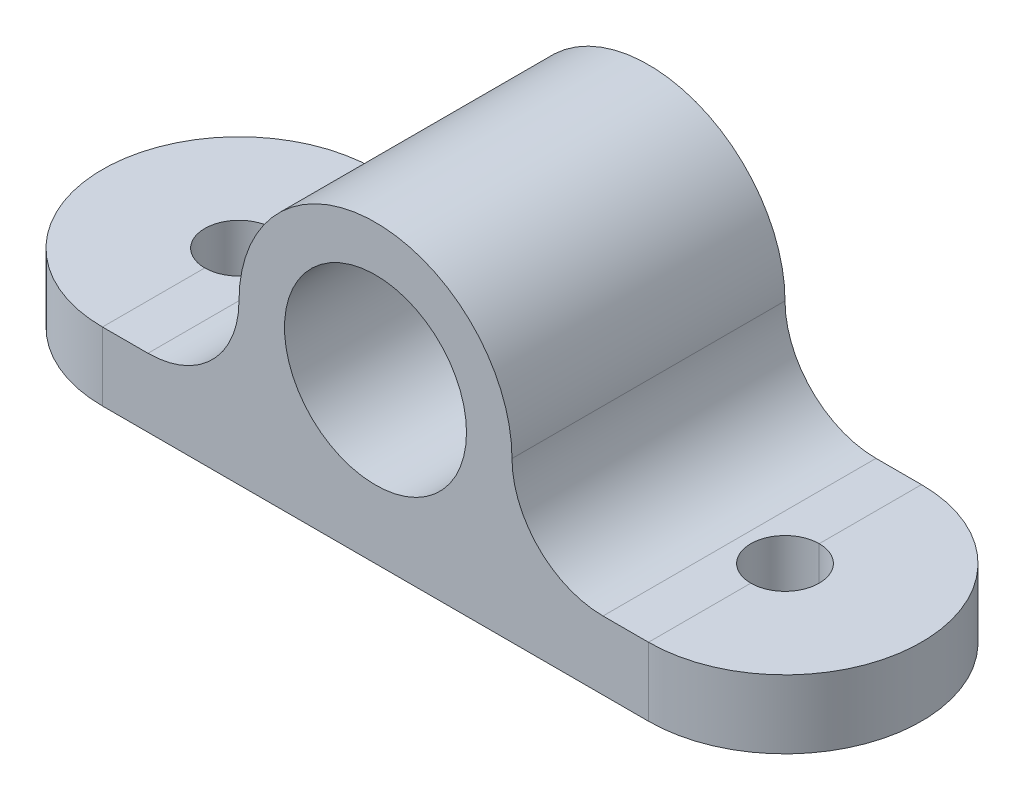
ISO-10303-21;
HEADER;
FILE_DESCRIPTION(('STEP AP214'),'2;1');
FILE_NAME('part.step','',(''),(''),'','','');
FILE_SCHEMA(('AUTOMOTIVE_DESIGN { 1 0 10303 214 1 1 1 1 }'));
ENDSEC;
DATA;
#1=APPLICATION_CONTEXT('core data for automotive mechanical design processes');
#2=APPLICATION_PROTOCOL_DEFINITION('international standard','automotive_design',2000,#1);
#3=PRODUCT_CONTEXT('',#1,'mechanical');
#4=PRODUCT('Part','Part','',(#3));
#5=PRODUCT_RELATED_PRODUCT_CATEGORY('part','',(#4));
#6=PRODUCT_DEFINITION_FORMATION('','',#4);
#7=PRODUCT_DEFINITION_CONTEXT('part definition',#1,'design');
#8=PRODUCT_DEFINITION('design','',#6,#7);
#9=PRODUCT_DEFINITION_SHAPE('','',#8);
#10=(LENGTH_UNIT() NAMED_UNIT(*) SI_UNIT(.MILLI.,.METRE.));
#11=(NAMED_UNIT(*) PLANE_ANGLE_UNIT() SI_UNIT($,.RADIAN.));
#12=(NAMED_UNIT(*) SI_UNIT($,.STERADIAN.) SOLID_ANGLE_UNIT());
#13=UNCERTAINTY_MEASURE_WITH_UNIT(LENGTH_MEASURE(1.E-05),#10,'distance_accuracy_value','');
#14=(GEOMETRIC_REPRESENTATION_CONTEXT(3) GLOBAL_UNCERTAINTY_ASSIGNED_CONTEXT((#13)) GLOBAL_UNIT_ASSIGNED_CONTEXT((#10,
#11,#12)) REPRESENTATION_CONTEXT('',''));
#15=CARTESIAN_POINT('',(0.,0.,0.));
#16=DIRECTION('',(0.,0.,1.));
#17=DIRECTION('',(1.,0.,0.));
#18=AXIS2_PLACEMENT_3D('',#15,#16,#17);
#19=CARTESIAN_POINT('',(0.,0.,0.));
#20=DIRECTION('',(1.,0.,0.));
#21=DIRECTION('',(0.,0.,-1.));
#22=AXIS2_PLACEMENT_3D('',#19,#20,#21);
#23=PLANE('',#22);
#24=DIRECTION('',(0.,1.,0.));
#25=VECTOR('',#24,1.);
#26=CARTESIAN_POINT('',(0.,0.,7.1374));
#27=LINE('',#26,#25);
#28=CARTESIAN_POINT('',(0.,0.,7.1374));
#29=VERTEX_POINT('',#28);
#30=CARTESIAN_POINT('',(0.,4.7752,7.1374));
#31=VERTEX_POINT('',#30);
#32=EDGE_CURVE('E62',#29,#31,#27,.T.);
#33=ORIENTED_EDGE('',*,*,#32,.F.);
#34=DIRECTION('',(0.,0.,-1.));
#35=VECTOR('',#34,1.);
#36=CARTESIAN_POINT('',(0.,0.,0.));
#37=LINE('',#36,#35);
#38=CARTESIAN_POINT('',(0.,0.,0.));
#39=VERTEX_POINT('',#38);
#40=EDGE_CURVE('E70',#29,#39,#37,.T.);
#41=ORIENTED_EDGE('',*,*,#40,.T.);
#42=DIRECTION('',(0.,1.,0.));
#43=VECTOR('',#42,1.);
#44=CARTESIAN_POINT('',(0.,0.,0.));
#45=LINE('',#44,#43);
#46=CARTESIAN_POINT('',(0.,4.7752,0.));
#47=VERTEX_POINT('',#46);
#48=EDGE_CURVE('E56',#39,#47,#45,.T.);
#49=ORIENTED_EDGE('',*,*,#48,.T.);
#50=DIRECTION('',(0.,0.,-1.));
#51=VECTOR('',#50,1.);
#52=CARTESIAN_POINT('',(0.,4.7752,0.));
#53=LINE('',#52,#51);
#54=EDGE_CURVE('E84',#31,#47,#53,.T.);
#55=ORIENTED_EDGE('',*,*,#54,.F.);
#56=EDGE_LOOP('',(#33,#41,#49,#55));
#57=FACE_BOUND('',#56,.T.);
#58=ADVANCED_FACE('F48',(#57),#23,.T.);
#59=CARTESIAN_POINT('',(0.,0.,9.525));
#60=DIRECTION('',(0.,1.,0.));
#61=DIRECTION('',(0.,0.,1.));
#62=AXIS2_PLACEMENT_3D('',#59,#60,#61);
#63=CYLINDRICAL_SURFACE('',#62,9.525);
#64=CARTESIAN_POINT('',(0.,4.7752,9.525));
#65=DIRECTION('',(0.,1.,0.));
#66=DIRECTION('',(0.,0.,1.));
#67=AXIS2_PLACEMENT_3D('',#64,#65,#66);
#68=CIRCLE('',#67,9.525);
#69=CARTESIAN_POINT('',(0.,4.7752,19.05));
#70=VERTEX_POINT('',#69);
#71=EDGE_CURVE('E88',#47,#70,#68,.T.);
#72=ORIENTED_EDGE('',*,*,#71,.F.);
#73=ORIENTED_EDGE('',*,*,#48,.F.);
#74=CARTESIAN_POINT('',(0.,0.,9.525));
#75=DIRECTION('',(0.,1.,0.));
#76=DIRECTION('',(0.,0.,1.));
#77=AXIS2_PLACEMENT_3D('',#74,#75,#76);
#78=CIRCLE('',#77,9.525);
#79=CARTESIAN_POINT('',(0.,0.,19.05));
#80=VERTEX_POINT('',#79);
#81=EDGE_CURVE('E103',#39,#80,#78,.T.);
#82=ORIENTED_EDGE('',*,*,#81,.T.);
#83=DIRECTION('',(0.,1.,0.));
#84=VECTOR('',#83,1.);
#85=CARTESIAN_POINT('',(0.,0.,19.05));
#86=LINE('',#85,#84);
#87=EDGE_CURVE('E95',#80,#70,#86,.T.);
#88=ORIENTED_EDGE('',*,*,#87,.T.);
#89=EDGE_LOOP('',(#72,#73,#82,#88));
#90=FACE_BOUND('',#89,.T.);
#91=ADVANCED_FACE('F50',(#90),#63,.T.);
#92=DIRECTION('',(0.,1.,0.));
#93=VECTOR('',#92,1.);
#94=CARTESIAN_POINT('',(0.,0.,11.9126));
#95=LINE('',#94,#93);
#96=CARTESIAN_POINT('',(0.,4.7752,11.9126));
#97=VERTEX_POINT('',#96);
#98=CARTESIAN_POINT('',(0.,0.,11.9126));
#99=VERTEX_POINT('',#98);
#100=EDGE_CURVE('E98',#97,#99,#95,.F.);
#101=ORIENTED_EDGE('',*,*,#100,.F.);
#102=EDGE_CURVE('E90',#70,#97,#53,.T.);
#103=ORIENTED_EDGE('',*,*,#102,.F.);
#104=ORIENTED_EDGE('',*,*,#87,.F.);
#105=EDGE_CURVE('E101',#80,#99,#37,.T.);
#106=ORIENTED_EDGE('',*,*,#105,.T.);
#107=EDGE_LOOP('',(#101,#103,#104,#106));
#108=FACE_BOUND('',#107,.T.);
#109=ADVANCED_FACE('F120',(#108),#23,.T.);
#110=CARTESIAN_POINT('',(0.,0.,9.525));
#111=DIRECTION('',(0.,1.,0.));
#112=DIRECTION('',(0.,0.,1.));
#113=AXIS2_PLACEMENT_3D('',#110,#111,#112);
#114=PLANE('',#113);
#115=ORIENTED_EDGE('',*,*,#40,.F.);
#116=CARTESIAN_POINT('',(0.,0.,9.525));
#117=DIRECTION('',(0.,1.,0.));
#118=DIRECTION('',(0.,0.,1.));
#119=AXIS2_PLACEMENT_3D('',#116,#117,#118);
#120=CIRCLE('',#119,2.3876);
#121=EDGE_CURVE('E112',#29,#99,#120,.T.);
#122=ORIENTED_EDGE('',*,*,#121,.T.);
#123=ORIENTED_EDGE('',*,*,#105,.F.);
#124=ORIENTED_EDGE('',*,*,#81,.F.);
#125=EDGE_LOOP('',(#115,#122,#123,#124));
#126=FACE_BOUND('',#125,.T.);
#127=ADVANCED_FACE('F115',(#126),#114,.F.);
#128=CARTESIAN_POINT('',(0.,4.7752,9.525));
#129=DIRECTION('',(0.,1.,0.));
#130=DIRECTION('',(0.,0.,1.));
#131=AXIS2_PLACEMENT_3D('',#128,#129,#130);
#132=PLANE('',#131);
#133=CARTESIAN_POINT('',(0.,4.7752,9.525));
#134=DIRECTION('',(0.,1.,0.));
#135=DIRECTION('',(0.,0.,1.));
#136=AXIS2_PLACEMENT_3D('',#133,#134,#135);
#137=CIRCLE('',#136,2.3876);
#138=EDGE_CURVE('E12',#31,#97,#137,.T.);
#139=ORIENTED_EDGE('',*,*,#138,.F.);
#140=ORIENTED_EDGE('',*,*,#54,.T.);
#141=ORIENTED_EDGE('',*,*,#71,.T.);
#142=ORIENTED_EDGE('',*,*,#102,.T.);
#143=EDGE_LOOP('',(#139,#140,#141,#142));
#144=FACE_BOUND('',#143,.T.);
#145=ADVANCED_FACE('F85',(#144),#132,.T.);
#146=CARTESIAN_POINT('',(0.,0.,9.525));
#147=DIRECTION('',(0.,1.,0.));
#148=DIRECTION('',(0.,0.,1.));
#149=AXIS2_PLACEMENT_3D('',#146,#147,#148);
#150=CYLINDRICAL_SURFACE('',#149,2.3876);
#151=ORIENTED_EDGE('',*,*,#32,.T.);
#152=ORIENTED_EDGE('',*,*,#138,.T.);
#153=ORIENTED_EDGE('',*,*,#100,.T.);
#154=ORIENTED_EDGE('',*,*,#121,.F.);
#155=EDGE_LOOP('',(#151,#152,#153,#154));
#156=FACE_BOUND('',#155,.T.);
#157=ADVANCED_FACE('F118',(#156),#150,.F.);
#158=CLOSED_SHELL('',(#58,#91,#109,#127,#145,#157));
#159=MANIFOLD_SOLID_BREP('B2',#158);
#160=CARTESIAN_POINT('',(38.1,0.,0.));
#161=DIRECTION('',(-1.,0.,0.));
#162=DIRECTION('',(0.,0.,1.));
#163=AXIS2_PLACEMENT_3D('',#160,#161,#162);
#164=PLANE('',#163);
#165=DIRECTION('',(0.,1.,0.));
#166=VECTOR('',#165,1.);
#167=CARTESIAN_POINT('',(38.1,0.,11.9126));
#168=LINE('',#167,#166);
#169=CARTESIAN_POINT('',(38.1,0.,11.9126));
#170=VERTEX_POINT('',#169);
#171=CARTESIAN_POINT('',(38.1,4.7752,11.9126));
#172=VERTEX_POINT('',#171);
#173=EDGE_CURVE('E193',#170,#172,#168,.T.);
#174=ORIENTED_EDGE('',*,*,#173,.F.);
#175=DIRECTION('',(0.,0.,1.));
#176=VECTOR('',#175,1.);
#177=CARTESIAN_POINT('',(38.1,0.,0.));
#178=LINE('',#177,#176);
#179=CARTESIAN_POINT('',(38.1,0.,19.05));
#180=VERTEX_POINT('',#179);
#181=EDGE_CURVE('E200',#170,#180,#178,.T.);
#182=ORIENTED_EDGE('',*,*,#181,.T.);
#183=DIRECTION('',(0.,1.,0.));
#184=VECTOR('',#183,1.);
#185=CARTESIAN_POINT('',(38.1,0.,19.05));
#186=LINE('',#185,#184);
#187=CARTESIAN_POINT('',(38.1,4.7752,19.05));
#188=VERTEX_POINT('',#187);
#189=EDGE_CURVE('E46',#180,#188,#186,.T.);
#190=ORIENTED_EDGE('',*,*,#189,.T.);
#191=DIRECTION('',(0.,0.,1.));
#192=VECTOR('',#191,1.);
#193=CARTESIAN_POINT('',(38.1,4.7752,0.));
#194=LINE('',#193,#192);
#195=EDGE_CURVE('E214',#172,#188,#194,.T.);
#196=ORIENTED_EDGE('',*,*,#195,.F.);
#197=EDGE_LOOP('',(#174,#182,#190,#196));
#198=FACE_BOUND('',#197,.T.);
#199=ADVANCED_FACE('F178',(#198),#164,.T.);
#200=CARTESIAN_POINT('',(38.1,0.,9.525));
#201=DIRECTION('',(0.,1.,0.));
#202=DIRECTION('',(0.,0.,1.));
#203=AXIS2_PLACEMENT_3D('',#200,#201,#202);
#204=CYLINDRICAL_SURFACE('',#203,9.525);
#205=CARTESIAN_POINT('',(38.1,4.7752,9.525));
#206=DIRECTION('',(0.,1.,0.));
#207=DIRECTION('',(0.,0.,1.));
#208=AXIS2_PLACEMENT_3D('',#205,#206,#207);
#209=CIRCLE('',#208,9.525);
#210=CARTESIAN_POINT('',(38.1,4.7752,0.));
#211=VERTEX_POINT('',#210);
#212=EDGE_CURVE('E218',#188,#211,#209,.T.);
#213=ORIENTED_EDGE('',*,*,#212,.F.);
#214=ORIENTED_EDGE('',*,*,#189,.F.);
#215=CARTESIAN_POINT('',(38.1,0.,9.525));
#216=DIRECTION('',(0.,1.,0.));
#217=DIRECTION('',(0.,0.,1.));
#218=AXIS2_PLACEMENT_3D('',#215,#216,#217);
#219=CIRCLE('',#218,9.525);
#220=CARTESIAN_POINT('',(38.1,0.,0.));
#221=VERTEX_POINT('',#220);
#222=EDGE_CURVE('E232',#180,#221,#219,.T.);
#223=ORIENTED_EDGE('',*,*,#222,.T.);
#224=DIRECTION('',(0.,1.,0.));
#225=VECTOR('',#224,1.);
#226=CARTESIAN_POINT('',(38.1,0.,0.));
#227=LINE('',#226,#225);
#228=EDGE_CURVE('E182',#221,#211,#227,.T.);
#229=ORIENTED_EDGE('',*,*,#228,.T.);
#230=EDGE_LOOP('',(#213,#214,#223,#229));
#231=FACE_BOUND('',#230,.T.);
#232=ADVANCED_FACE('F180',(#231),#204,.T.);
#233=DIRECTION('',(0.,1.,0.));
#234=VECTOR('',#233,1.);
#235=CARTESIAN_POINT('',(38.1,0.,7.1374));
#236=LINE('',#235,#234);
#237=CARTESIAN_POINT('',(38.1,4.7752,7.1374));
#238=VERTEX_POINT('',#237);
#239=CARTESIAN_POINT('',(38.1,0.,7.1374));
#240=VERTEX_POINT('',#239);
#241=EDGE_CURVE('E227',#238,#240,#236,.F.);
#242=ORIENTED_EDGE('',*,*,#241,.F.);
#243=EDGE_CURVE('E221',#211,#238,#194,.T.);
#244=ORIENTED_EDGE('',*,*,#243,.F.);
#245=ORIENTED_EDGE('',*,*,#228,.F.);
#246=EDGE_CURVE('E230',#221,#240,#178,.T.);
#247=ORIENTED_EDGE('',*,*,#246,.T.);
#248=EDGE_LOOP('',(#242,#244,#245,#247));
#249=FACE_BOUND('',#248,.T.);
#250=ADVANCED_FACE('F248',(#249),#164,.T.);
#251=CARTESIAN_POINT('',(38.1,0.,9.525));
#252=DIRECTION('',(0.,1.,0.));
#253=DIRECTION('',(0.,0.,1.));
#254=AXIS2_PLACEMENT_3D('',#251,#252,#253);
#255=PLANE('',#254);
#256=ORIENTED_EDGE('',*,*,#181,.F.);
#257=CARTESIAN_POINT('',(38.1,0.,9.525));
#258=DIRECTION('',(0.,1.,0.));
#259=DIRECTION('',(0.,0.,1.));
#260=AXIS2_PLACEMENT_3D('',#257,#258,#259);
#261=CIRCLE('',#260,2.3876);
#262=EDGE_CURVE('E237',#170,#240,#261,.T.);
#263=ORIENTED_EDGE('',*,*,#262,.T.);
#264=ORIENTED_EDGE('',*,*,#246,.F.);
#265=ORIENTED_EDGE('',*,*,#222,.F.);
#266=EDGE_LOOP('',(#256,#263,#264,#265));
#267=FACE_BOUND('',#266,.T.);
#268=ADVANCED_FACE('F243',(#267),#255,.F.);
#269=CARTESIAN_POINT('',(38.1,4.7752,9.525));
#270=DIRECTION('',(0.,1.,0.));
#271=DIRECTION('',(0.,0.,1.));
#272=AXIS2_PLACEMENT_3D('',#269,#270,#271);
#273=PLANE('',#272);
#274=CARTESIAN_POINT('',(38.1,4.7752,9.525));
#275=DIRECTION('',(0.,1.,0.));
#276=DIRECTION('',(0.,0.,1.));
#277=AXIS2_PLACEMENT_3D('',#274,#275,#276);
#278=CIRCLE('',#277,2.3876);
#279=EDGE_CURVE('E220',#172,#238,#278,.T.);
#280=ORIENTED_EDGE('',*,*,#279,.F.);
#281=ORIENTED_EDGE('',*,*,#195,.T.);
#282=ORIENTED_EDGE('',*,*,#212,.T.);
#283=ORIENTED_EDGE('',*,*,#243,.T.);
#284=EDGE_LOOP('',(#280,#281,#282,#283));
#285=FACE_BOUND('',#284,.T.);
#286=ADVANCED_FACE('F215',(#285),#273,.T.);
#287=CARTESIAN_POINT('',(38.1,0.,9.525));
#288=DIRECTION('',(0.,1.,0.));
#289=DIRECTION('',(0.,0.,1.));
#290=AXIS2_PLACEMENT_3D('',#287,#288,#289);
#291=CYLINDRICAL_SURFACE('',#290,2.3876);
#292=ORIENTED_EDGE('',*,*,#173,.T.);
#293=ORIENTED_EDGE('',*,*,#279,.T.);
#294=ORIENTED_EDGE('',*,*,#241,.T.);
#295=ORIENTED_EDGE('',*,*,#262,.F.);
#296=EDGE_LOOP('',(#292,#293,#294,#295));
#297=FACE_BOUND('',#296,.T.);
#298=ADVANCED_FACE('F249',(#297),#291,.F.);
#299=CLOSED_SHELL('',(#199,#232,#250,#268,#286,#298));
#300=MANIFOLD_SOLID_BREP('B6',#299);
#301=CARTESIAN_POINT('',(0.,0.,19.05));
#302=DIRECTION('',(-1.,0.,0.));
#303=DIRECTION('',(0.,0.,1.));
#304=AXIS2_PLACEMENT_3D('',#301,#302,#303);
#305=PLANE('',#304);
#306=DIRECTION('',(0.,1.,0.));
#307=VECTOR('',#306,1.);
#308=CARTESIAN_POINT('',(0.,0.,11.9126));
#309=LINE('',#308,#307);
#310=CARTESIAN_POINT('',(0.,0.,11.9126));
#311=VERTEX_POINT('',#310);
#312=CARTESIAN_POINT('',(0.,4.7752,11.9126));
#313=VERTEX_POINT('',#312);
#314=EDGE_CURVE('E488',#311,#313,#309,.T.);
#315=ORIENTED_EDGE('',*,*,#314,.F.);
#316=DIRECTION('',(0.,0.,-1.));
#317=VECTOR('',#316,1.);
#318=CARTESIAN_POINT('',(0.,0.,19.05));
#319=LINE('',#318,#317);
#320=CARTESIAN_POINT('',(0.,0.,19.05));
#321=VERTEX_POINT('',#320);
#322=EDGE_CURVE('E417',#321,#311,#319,.T.);
#323=ORIENTED_EDGE('',*,*,#322,.F.);
#324=DIRECTION('',(0.,1.,0.));
#325=VECTOR('',#324,1.);
#326=CARTESIAN_POINT('',(0.,0.,19.05));
#327=LINE('',#326,#325);
#328=CARTESIAN_POINT('',(0.,4.7752,19.05));
#329=VERTEX_POINT('',#328);
#330=EDGE_CURVE('E490',#321,#329,#327,.T.);
#331=ORIENTED_EDGE('',*,*,#330,.T.);
#332=DIRECTION('',(0.,0.,-1.));
#333=VECTOR('',#332,1.);
#334=CARTESIAN_POINT('',(0.,4.7752,19.05));
#335=LINE('',#334,#333);
#336=EDGE_CURVE('E425',#329,#313,#335,.T.);
#337=ORIENTED_EDGE('',*,*,#336,.T.);
#338=EDGE_LOOP('',(#315,#323,#331,#337));
#339=FACE_BOUND('',#338,.T.);
#340=ADVANCED_FACE('F299',(#339),#305,.T.);
#341=CARTESIAN_POINT('',(38.1,0.,19.05));
#342=DIRECTION('',(-1.,0.,0.));
#343=DIRECTION('',(0.,0.,1.));
#344=AXIS2_PLACEMENT_3D('',#341,#342,#343);
#345=PLANE('',#344);
#346=DIRECTION('',(0.,0.,-1.));
#347=VECTOR('',#346,1.);
#348=CARTESIAN_POINT('',(38.1,0.,19.05));
#349=LINE('',#348,#347);
#350=CARTESIAN_POINT('',(38.1,0.,19.05));
#351=VERTEX_POINT('',#350);
#352=CARTESIAN_POINT('',(38.1,0.,11.9126));
#353=VERTEX_POINT('',#352);
#354=EDGE_CURVE('E406',#351,#353,#349,.T.);
#355=ORIENTED_EDGE('',*,*,#354,.T.);
#356=DIRECTION('',(0.,1.,0.));
#357=VECTOR('',#356,1.);
#358=CARTESIAN_POINT('',(38.1,0.,11.9126));
#359=LINE('',#358,#357);
#360=CARTESIAN_POINT('',(38.1,4.7752,11.9126));
#361=VERTEX_POINT('',#360);
#362=EDGE_CURVE('E387',#353,#361,#359,.T.);
#363=ORIENTED_EDGE('',*,*,#362,.T.);
#364=DIRECTION('',(0.,0.,-1.));
#365=VECTOR('',#364,1.);
#366=CARTESIAN_POINT('',(38.1,4.7752,19.05));
#367=LINE('',#366,#365);
#368=CARTESIAN_POINT('',(38.1,4.7752,19.05));
#369=VERTEX_POINT('',#368);
#370=EDGE_CURVE('E419',#369,#361,#367,.T.);
#371=ORIENTED_EDGE('',*,*,#370,.F.);
#372=DIRECTION('',(0.,1.,0.));
#373=VECTOR('',#372,1.);
#374=CARTESIAN_POINT('',(38.1,0.,19.05));
#375=LINE('',#374,#373);
#376=EDGE_CURVE('E413',#351,#369,#375,.T.);
#377=ORIENTED_EDGE('',*,*,#376,.F.);
#378=EDGE_LOOP('',(#355,#363,#371,#377));
#379=FACE_BOUND('',#378,.T.);
#380=ADVANCED_FACE('F411',(#379),#345,.F.);
#381=CARTESIAN_POINT('',(19.05,11.0998,19.05));
#382=DIRECTION('',(0.,0.,-1.));
#383=DIRECTION('',(-1.,0.,0.));
#384=AXIS2_PLACEMENT_3D('',#381,#382,#383);
#385=CYLINDRICAL_SURFACE('',#384,9.525);
#386=CARTESIAN_POINT('',(19.05,11.0998,0.));
#387=DIRECTION('',(0.,0.,1.));
#388=DIRECTION('',(1.,0.,0.));
#389=AXIS2_PLACEMENT_3D('',#386,#387,#388);
#390=CIRCLE('',#389,9.525);
#391=CARTESIAN_POINT('',(28.5749878079922,11.11504,0.));
#392=VERTEX_POINT('',#391);
#393=CARTESIAN_POINT('',(9.52501219200781,11.11504,0.));
#394=VERTEX_POINT('',#393);
#395=EDGE_CURVE('E457',#392,#394,#390,.T.);
#396=ORIENTED_EDGE('',*,*,#395,.T.);
#397=DIRECTION('',(0.,0.,-1.));
#398=VECTOR('',#397,1.);
#399=CARTESIAN_POINT('',(9.52501219200781,11.11504,19.05));
#400=LINE('',#399,#398);
#401=CARTESIAN_POINT('',(9.52501219200781,11.11504,19.05));
#402=VERTEX_POINT('',#401);
#403=EDGE_CURVE('E320',#394,#402,#400,.F.);
#404=ORIENTED_EDGE('',*,*,#403,.T.);
#405=CARTESIAN_POINT('',(19.05,11.0998,19.05));
#406=DIRECTION('',(0.,0.,1.));
#407=DIRECTION('',(1.,0.,0.));
#408=AXIS2_PLACEMENT_3D('',#405,#406,#407);
#409=CIRCLE('',#408,9.525);
#410=CARTESIAN_POINT('',(28.5749878079922,11.11504,19.05));
#411=VERTEX_POINT('',#410);
#412=EDGE_CURVE('E470',#411,#402,#409,.T.);
#413=ORIENTED_EDGE('',*,*,#412,.F.);
#414=DIRECTION('',(0.,0.,-1.));
#415=VECTOR('',#414,1.);
#416=CARTESIAN_POINT('',(28.5749878079922,11.11504,19.05));
#417=LINE('',#416,#415);
#418=EDGE_CURVE('E429',#411,#392,#417,.T.);
#419=ORIENTED_EDGE('',*,*,#418,.T.);
#420=EDGE_LOOP('',(#396,#404,#413,#419));
#421=FACE_BOUND('',#420,.T.);
#422=ADVANCED_FACE('F521',(#421),#385,.T.);
#423=CARTESIAN_POINT('',(0.,4.7752,19.05));
#424=DIRECTION('',(0.,1.,0.));
#425=DIRECTION('',(0.,0.,1.));
#426=AXIS2_PLACEMENT_3D('',#423,#424,#425);
#427=PLANE('',#426);
#428=DIRECTION('',(1.,0.,0.));
#429=VECTOR('',#428,1.);
#430=CARTESIAN_POINT('',(0.,4.7752,19.05));
#431=LINE('',#430,#429);
#432=CARTESIAN_POINT('',(3.17502032001301,4.7752,19.05));
#433=VERTEX_POINT('',#432);
#434=EDGE_CURVE('E450',#329,#433,#431,.T.);
#435=ORIENTED_EDGE('',*,*,#434,.T.);
#436=DIRECTION('',(0.,0.,-1.));
#437=VECTOR('',#436,1.);
#438=CARTESIAN_POINT('',(3.17502032001301,4.7752,19.05));
#439=LINE('',#438,#437);
#440=CARTESIAN_POINT('',(3.17502032001301,4.7752,0.));
#441=VERTEX_POINT('',#440);
#442=EDGE_CURVE('E438',#433,#441,#439,.T.);
#443=ORIENTED_EDGE('',*,*,#442,.T.);
#444=DIRECTION('',(1.,0.,0.));
#445=VECTOR('',#444,1.);
#446=CARTESIAN_POINT('',(0.,4.7752,0.));
#447=LINE('',#446,#445);
#448=CARTESIAN_POINT('',(0.,4.7752,0.));
#449=VERTEX_POINT('',#448);
#450=EDGE_CURVE('E447',#449,#441,#447,.T.);
#451=ORIENTED_EDGE('',*,*,#450,.F.);
#452=CARTESIAN_POINT('',(0.,4.7752,7.1374));
#453=VERTEX_POINT('',#452);
#454=EDGE_CURVE('E424',#453,#449,#335,.T.);
#455=ORIENTED_EDGE('',*,*,#454,.F.);
#456=CARTESIAN_POINT('',(0.,4.7752,9.525));
#457=DIRECTION('',(0.,1.,0.));
#458=DIRECTION('',(0.,0.,1.));
#459=AXIS2_PLACEMENT_3D('',#456,#457,#458);
#460=CIRCLE('',#459,2.3876);
#461=EDGE_CURVE('E482',#313,#453,#460,.T.);
#462=ORIENTED_EDGE('',*,*,#461,.F.);
#463=ORIENTED_EDGE('',*,*,#336,.F.);
#464=EDGE_LOOP('',(#435,#443,#451,#455,#462,#463));
#465=FACE_BOUND('',#464,.T.);
#466=ADVANCED_FACE('F445',(#465),#427,.T.);
#467=DIRECTION('',(0.,1.,0.));
#468=VECTOR('',#467,1.);
#469=CARTESIAN_POINT('',(0.,0.,7.1374));
#470=LINE('',#469,#468);
#471=CARTESIAN_POINT('',(0.,0.,7.1374));
#472=VERTEX_POINT('',#471);
#473=EDGE_CURVE('E398',#453,#472,#470,.F.);
#474=ORIENTED_EDGE('',*,*,#473,.F.);
#475=ORIENTED_EDGE('',*,*,#454,.T.);
#476=DIRECTION('',(0.,1.,0.));
#477=VECTOR('',#476,1.);
#478=CARTESIAN_POINT('',(0.,0.,0.));
#479=LINE('',#478,#477);
#480=CARTESIAN_POINT('',(0.,0.,0.));
#481=VERTEX_POINT('',#480);
#482=EDGE_CURVE('E456',#481,#449,#479,.T.);
#483=ORIENTED_EDGE('',*,*,#482,.F.);
#484=EDGE_CURVE('E415',#472,#481,#319,.T.);
#485=ORIENTED_EDGE('',*,*,#484,.F.);
#486=EDGE_LOOP('',(#474,#475,#483,#485));
#487=FACE_BOUND('',#486,.T.);
#488=ADVANCED_FACE('F480',(#487),#305,.T.);
#489=CARTESIAN_POINT('',(0.,0.,19.05));
#490=DIRECTION('',(0.,1.,0.));
#491=DIRECTION('',(0.,0.,1.));
#492=AXIS2_PLACEMENT_3D('',#489,#490,#491);
#493=PLANE('',#492);
#494=CARTESIAN_POINT('',(38.1,0.,7.1374));
#495=VERTEX_POINT('',#494);
#496=CARTESIAN_POINT('',(38.1,0.,0.));
#497=VERTEX_POINT('',#496);
#498=EDGE_CURVE('E408',#495,#497,#349,.T.);
#499=ORIENTED_EDGE('',*,*,#498,.F.);
#500=CARTESIAN_POINT('',(38.1,0.,9.525));
#501=DIRECTION('',(0.,1.,0.));
#502=DIRECTION('',(0.,0.,1.));
#503=AXIS2_PLACEMENT_3D('',#500,#501,#502);
#504=CIRCLE('',#503,2.3876);
#505=EDGE_CURVE('E390',#495,#353,#504,.T.);
#506=ORIENTED_EDGE('',*,*,#505,.T.);
#507=ORIENTED_EDGE('',*,*,#354,.F.);
#508=DIRECTION('',(1.,0.,0.));
#509=VECTOR('',#508,1.);
#510=CARTESIAN_POINT('',(0.,0.,19.05));
#511=LINE('',#510,#509);
#512=EDGE_CURVE('E492',#321,#351,#511,.T.);
#513=ORIENTED_EDGE('',*,*,#512,.F.);
#514=ORIENTED_EDGE('',*,*,#322,.T.);
#515=CARTESIAN_POINT('',(0.,0.,9.525));
#516=DIRECTION('',(0.,1.,0.));
#517=DIRECTION('',(0.,0.,1.));
#518=AXIS2_PLACEMENT_3D('',#515,#516,#517);
#519=CIRCLE('',#518,2.3876);
#520=EDGE_CURVE('E409',#311,#472,#519,.T.);
#521=ORIENTED_EDGE('',*,*,#520,.T.);
#522=ORIENTED_EDGE('',*,*,#484,.T.);
#523=DIRECTION('',(1.,0.,0.));
#524=VECTOR('',#523,1.);
#525=CARTESIAN_POINT('',(0.,0.,0.));
#526=LINE('',#525,#524);
#527=EDGE_CURVE('E460',#481,#497,#526,.T.);
#528=ORIENTED_EDGE('',*,*,#527,.T.);
#529=EDGE_LOOP('',(#499,#506,#507,#513,#514,#521,#522,#528));
#530=FACE_BOUND('',#529,.T.);
#531=ADVANCED_FACE('F404',(#530),#493,.F.);
#532=CARTESIAN_POINT('',(38.1,4.7752,7.1374));
#533=VERTEX_POINT('',#532);
#534=CARTESIAN_POINT('',(38.1,4.7752,0.));
#535=VERTEX_POINT('',#534);
#536=EDGE_CURVE('E549',#533,#535,#367,.T.);
#537=ORIENTED_EDGE('',*,*,#536,.F.);
#538=DIRECTION('',(0.,1.,0.));
#539=VECTOR('',#538,1.);
#540=CARTESIAN_POINT('',(38.1,0.,7.1374));
#541=LINE('',#540,#539);
#542=EDGE_CURVE('E399',#533,#495,#541,.F.);
#543=ORIENTED_EDGE('',*,*,#542,.T.);
#544=ORIENTED_EDGE('',*,*,#498,.T.);
#545=DIRECTION('',(0.,1.,0.));
#546=VECTOR('',#545,1.);
#547=CARTESIAN_POINT('',(38.1,0.,0.));
#548=LINE('',#547,#546);
#549=EDGE_CURVE('E465',#497,#535,#548,.T.);
#550=ORIENTED_EDGE('',*,*,#549,.T.);
#551=EDGE_LOOP('',(#537,#543,#544,#550));
#552=FACE_BOUND('',#551,.T.);
#553=ADVANCED_FACE('F523',(#552),#345,.F.);
#554=CARTESIAN_POINT('',(19.05,11.0998,19.05));
#555=DIRECTION('',(0.,0.,-1.));
#556=DIRECTION('',(-1.,0.,0.));
#557=AXIS2_PLACEMENT_3D('',#554,#555,#556);
#558=CYLINDRICAL_SURFACE('',#557,6.35);
#559=CARTESIAN_POINT('',(19.05,11.0998,0.));
#560=DIRECTION('',(0.,0.,1.));
#561=DIRECTION('',(1.,0.,0.));
#562=AXIS2_PLACEMENT_3D('',#559,#560,#561);
#563=CIRCLE('',#562,6.35);
#564=CARTESIAN_POINT('',(25.4,11.0998,0.));
#565=VERTEX_POINT('',#564);
#566=EDGE_CURVE('E462',#565,#565,#563,.T.);
#567=ORIENTED_EDGE('',*,*,#566,.F.);
#568=EDGE_LOOP('',(#567));
#569=FACE_BOUND('',#568,.T.);
#570=CARTESIAN_POINT('',(19.05,11.0998,19.05));
#571=DIRECTION('',(0.,0.,1.));
#572=DIRECTION('',(1.,0.,0.));
#573=AXIS2_PLACEMENT_3D('',#570,#571,#572);
#574=CIRCLE('',#573,6.35);
#575=CARTESIAN_POINT('',(25.4,11.0998,19.05));
#576=VERTEX_POINT('',#575);
#577=EDGE_CURVE('E464',#576,#576,#574,.T.);
#578=ORIENTED_EDGE('',*,*,#577,.T.);
#579=EDGE_LOOP('',(#578));
#580=FACE_BOUND('',#579,.T.);
#581=ADVANCED_FACE('F538',(#569,#580),#558,.F.);
#582=CARTESIAN_POINT('',(34.924979679987,4.7752,0.));
#583=VERTEX_POINT('',#582);
#584=EDGE_CURVE('E459',#583,#535,#447,.T.);
#585=ORIENTED_EDGE('',*,*,#584,.F.);
#586=DIRECTION('',(0.,0.,-1.));
#587=VECTOR('',#586,1.);
#588=CARTESIAN_POINT('',(34.924979679987,4.7752,19.05));
#589=LINE('',#588,#587);
#590=CARTESIAN_POINT('',(34.924979679987,4.7752,19.05));
#591=VERTEX_POINT('',#590);
#592=EDGE_CURVE('E432',#583,#591,#589,.F.);
#593=ORIENTED_EDGE('',*,*,#592,.T.);
#594=EDGE_CURVE('E496',#591,#369,#431,.T.);
#595=ORIENTED_EDGE('',*,*,#594,.T.);
#596=ORIENTED_EDGE('',*,*,#370,.T.);
#597=CARTESIAN_POINT('',(38.1,4.7752,9.525));
#598=DIRECTION('',(0.,1.,0.));
#599=DIRECTION('',(0.,0.,1.));
#600=AXIS2_PLACEMENT_3D('',#597,#598,#599);
#601=CIRCLE('',#600,2.3876);
#602=EDGE_CURVE('E393',#533,#361,#601,.T.);
#603=ORIENTED_EDGE('',*,*,#602,.F.);
#604=ORIENTED_EDGE('',*,*,#536,.T.);
#605=EDGE_LOOP('',(#585,#593,#595,#596,#603,#604));
#606=FACE_BOUND('',#605,.T.);
#607=ADVANCED_FACE('F532',(#606),#427,.T.);
#608=CARTESIAN_POINT('',(0.,0.,19.05));
#609=DIRECTION('',(0.,0.,1.));
#610=DIRECTION('',(1.,0.,0.));
#611=AXIS2_PLACEMENT_3D('',#608,#609,#610);
#612=PLANE('',#611);
#613=ORIENTED_EDGE('',*,*,#577,.F.);
#614=EDGE_LOOP('',(#613));
#615=FACE_BOUND('',#614,.T.);
#616=ORIENTED_EDGE('',*,*,#594,.F.);
#617=CARTESIAN_POINT('',(34.924979679987,11.1252,19.05));
#618=DIRECTION('',(0.,0.,1.));
#619=DIRECTION('',(1.,0.,0.));
#620=AXIS2_PLACEMENT_3D('',#617,#618,#619);
#621=CIRCLE('',#620,6.35);
#622=EDGE_CURVE('E436',#591,#411,#621,.F.);
#623=ORIENTED_EDGE('',*,*,#622,.T.);
#624=ORIENTED_EDGE('',*,*,#412,.T.);
#625=CARTESIAN_POINT('',(3.17502032001301,11.1252,19.05));
#626=DIRECTION('',(0.,0.,1.));
#627=DIRECTION('',(1.,0.,0.));
#628=AXIS2_PLACEMENT_3D('',#625,#626,#627);
#629=CIRCLE('',#628,6.35);
#630=EDGE_CURVE('E176',#402,#433,#629,.F.);
#631=ORIENTED_EDGE('',*,*,#630,.T.);
#632=ORIENTED_EDGE('',*,*,#434,.F.);
#633=ORIENTED_EDGE('',*,*,#330,.F.);
#634=ORIENTED_EDGE('',*,*,#512,.T.);
#635=ORIENTED_EDGE('',*,*,#376,.T.);
#636=EDGE_LOOP('',(#616,#623,#624,#631,#632,#633,#634,#635));
#637=FACE_BOUND('',#636,.T.);
#638=ADVANCED_FACE('F506',(#615,#637),#612,.T.);
#639=CARTESIAN_POINT('',(0.,0.,0.));
#640=DIRECTION('',(0.,0.,1.));
#641=DIRECTION('',(1.,0.,0.));
#642=AXIS2_PLACEMENT_3D('',#639,#640,#641);
#643=PLANE('',#642);
#644=ORIENTED_EDGE('',*,*,#566,.T.);
#645=EDGE_LOOP('',(#644));
#646=FACE_BOUND('',#645,.T.);
#647=ORIENTED_EDGE('',*,*,#395,.F.);
#648=CARTESIAN_POINT('',(34.924979679987,11.1252,0.));
#649=DIRECTION('',(0.,0.,1.));
#650=DIRECTION('',(1.,0.,0.));
#651=AXIS2_PLACEMENT_3D('',#648,#649,#650);
#652=CIRCLE('',#651,6.35);
#653=EDGE_CURVE('E434',#392,#583,#652,.T.);
#654=ORIENTED_EDGE('',*,*,#653,.T.);
#655=ORIENTED_EDGE('',*,*,#584,.T.);
#656=ORIENTED_EDGE('',*,*,#549,.F.);
#657=ORIENTED_EDGE('',*,*,#527,.F.);
#658=ORIENTED_EDGE('',*,*,#482,.T.);
#659=ORIENTED_EDGE('',*,*,#450,.T.);
#660=CARTESIAN_POINT('',(3.17502032001301,11.1252,0.));
#661=DIRECTION('',(0.,0.,1.));
#662=DIRECTION('',(1.,0.,0.));
#663=AXIS2_PLACEMENT_3D('',#660,#661,#662);
#664=CIRCLE('',#663,6.35);
#665=EDGE_CURVE('E307',#441,#394,#664,.T.);
#666=ORIENTED_EDGE('',*,*,#665,.T.);
#667=EDGE_LOOP('',(#647,#654,#655,#656,#657,#658,#659,#666));
#668=FACE_BOUND('',#667,.T.);
#669=ADVANCED_FACE('F453',(#646,#668),#643,.F.);
#670=CARTESIAN_POINT('',(38.1,0.,9.525));
#671=DIRECTION('',(0.,1.,0.));
#672=DIRECTION('',(0.,0.,1.));
#673=AXIS2_PLACEMENT_3D('',#670,#671,#672);
#674=CYLINDRICAL_SURFACE('',#673,2.3876);
#675=ORIENTED_EDGE('',*,*,#505,.F.);
#676=ORIENTED_EDGE('',*,*,#542,.F.);
#677=ORIENTED_EDGE('',*,*,#602,.T.);
#678=ORIENTED_EDGE('',*,*,#362,.F.);
#679=EDGE_LOOP('',(#675,#676,#677,#678));
#680=FACE_BOUND('',#679,.T.);
#681=ADVANCED_FACE('F389',(#680),#674,.F.);
#682=CARTESIAN_POINT('',(0.,0.,9.525));
#683=DIRECTION('',(0.,1.,0.));
#684=DIRECTION('',(0.,0.,1.));
#685=AXIS2_PLACEMENT_3D('',#682,#683,#684);
#686=CYLINDRICAL_SURFACE('',#685,2.3876);
#687=ORIENTED_EDGE('',*,*,#314,.T.);
#688=ORIENTED_EDGE('',*,*,#461,.T.);
#689=ORIENTED_EDGE('',*,*,#473,.T.);
#690=ORIENTED_EDGE('',*,*,#520,.F.);
#691=EDGE_LOOP('',(#687,#688,#689,#690));
#692=FACE_BOUND('',#691,.T.);
#693=ADVANCED_FACE('F514',(#692),#686,.F.);
#694=CARTESIAN_POINT('',(34.924979679987,11.1252,19.05));
#695=DIRECTION('',(0.,0.,-1.));
#696=DIRECTION('',(-1.,0.,0.));
#697=AXIS2_PLACEMENT_3D('',#694,#695,#696);
#698=CYLINDRICAL_SURFACE('',#697,6.35);
#699=ORIENTED_EDGE('',*,*,#622,.F.);
#700=ORIENTED_EDGE('',*,*,#592,.F.);
#701=ORIENTED_EDGE('',*,*,#653,.F.);
#702=ORIENTED_EDGE('',*,*,#418,.F.);
#703=EDGE_LOOP('',(#699,#700,#701,#702));
#704=FACE_BOUND('',#703,.T.);
#705=ADVANCED_FACE('F510',(#704),#698,.F.);
#706=CARTESIAN_POINT('',(3.17502032001301,11.1252,19.05));
#707=DIRECTION('',(0.,0.,-1.));
#708=DIRECTION('',(-1.,0.,0.));
#709=AXIS2_PLACEMENT_3D('',#706,#707,#708);
#710=CYLINDRICAL_SURFACE('',#709,6.35);
#711=ORIENTED_EDGE('',*,*,#630,.F.);
#712=ORIENTED_EDGE('',*,*,#403,.F.);
#713=ORIENTED_EDGE('',*,*,#665,.F.);
#714=ORIENTED_EDGE('',*,*,#442,.F.);
#715=EDGE_LOOP('',(#711,#712,#713,#714));
#716=FACE_BOUND('',#715,.T.);
#717=ADVANCED_FACE('F301',(#716),#710,.F.);
#718=CLOSED_SHELL('',(#340,#380,#422,#466,#488,#531,#553,#581,#607,#638,#669,#681,#693,#705,#717));
#719=MANIFOLD_SOLID_BREP('B40',#718);
#720=ADVANCED_BREP_SHAPE_REPRESENTATION('',(#18,#159,#300,#719),#14);
#721=SHAPE_DEFINITION_REPRESENTATION(#9,#720);
ENDSEC;
END-ISO-10303-21;
